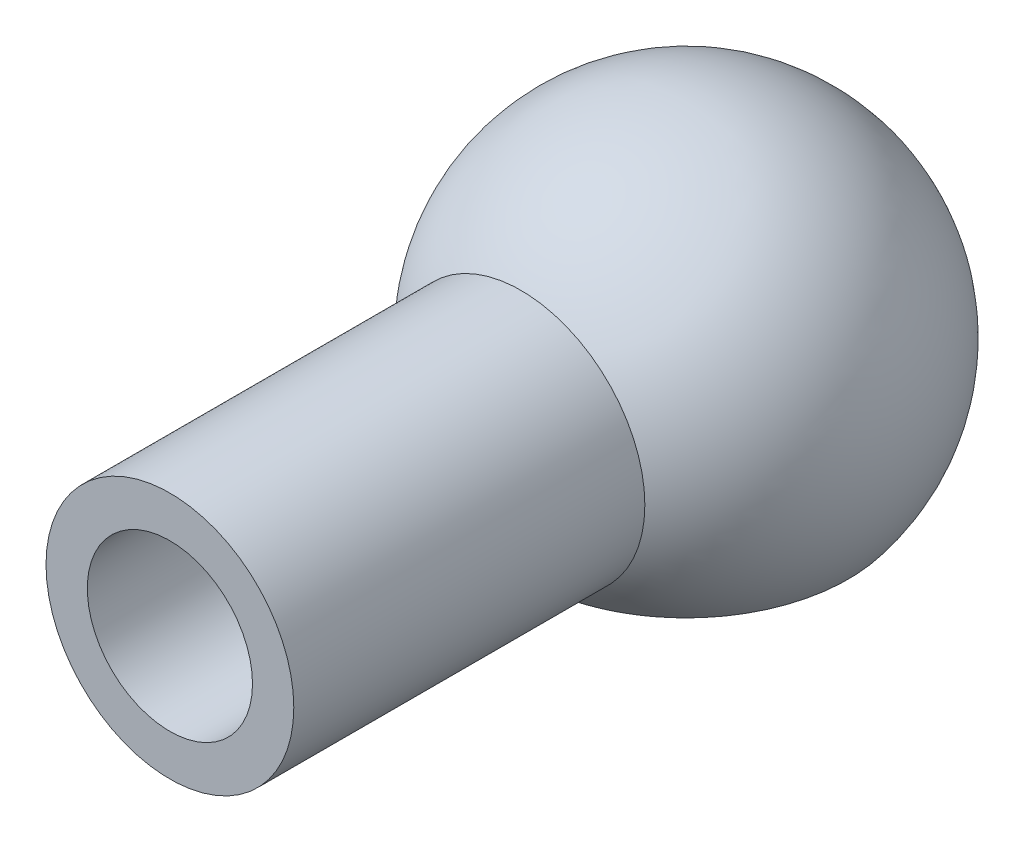
ISO-10303-21;
HEADER;
FILE_DESCRIPTION(('STEP AP214'),'2;1');
FILE_NAME('part.step','',(''),(''),'','','');
FILE_SCHEMA(('AUTOMOTIVE_DESIGN { 1 0 10303 214 1 1 1 1 }'));
ENDSEC;
DATA;
#1=APPLICATION_CONTEXT('core data for automotive mechanical design processes');
#2=APPLICATION_PROTOCOL_DEFINITION('international standard','automotive_design',2000,#1);
#3=PRODUCT_CONTEXT('',#1,'mechanical');
#4=PRODUCT('Part','Part','',(#3));
#5=PRODUCT_RELATED_PRODUCT_CATEGORY('part','',(#4));
#6=PRODUCT_DEFINITION_FORMATION('','',#4);
#7=PRODUCT_DEFINITION_CONTEXT('part definition',#1,'design');
#8=PRODUCT_DEFINITION('design','',#6,#7);
#9=PRODUCT_DEFINITION_SHAPE('','',#8);
#10=(LENGTH_UNIT() NAMED_UNIT(*) SI_UNIT(.MILLI.,.METRE.));
#11=(NAMED_UNIT(*) PLANE_ANGLE_UNIT() SI_UNIT($,.RADIAN.));
#12=(NAMED_UNIT(*) SI_UNIT($,.STERADIAN.) SOLID_ANGLE_UNIT());
#13=UNCERTAINTY_MEASURE_WITH_UNIT(LENGTH_MEASURE(1.E-05),#10,'distance_accuracy_value','');
#14=(GEOMETRIC_REPRESENTATION_CONTEXT(3) GLOBAL_UNCERTAINTY_ASSIGNED_CONTEXT((#13)) GLOBAL_UNIT_ASSIGNED_CONTEXT((#10,
#11,#12)) REPRESENTATION_CONTEXT('',''));
#15=CARTESIAN_POINT('',(0.,0.,0.));
#16=DIRECTION('',(0.,0.,1.));
#17=DIRECTION('',(1.,0.,0.));
#18=AXIS2_PLACEMENT_3D('',#15,#16,#17);
#19=CARTESIAN_POINT('',(0.,0.,0.));
#20=DIRECTION('',(0.,0.,1.));
#21=DIRECTION('',(-1.,0.,0.));
#22=AXIS2_PLACEMENT_3D('',#19,#20,#21);
#23=SPHERICAL_SURFACE('',#22,10.);
#24=CARTESIAN_POINT('',(0.,-6.18589574131742,0.));
#25=DIRECTION('',(0.,-1.,0.));
#26=DIRECTION('',(0.,0.,-1.));
#27=AXIS2_PLACEMENT_3D('',#24,#25,#26);
#28=CIRCLE('',#27,7.85714285714286);
#29=CARTESIAN_POINT('',(0.,-6.18589574131742,-7.85714285714286));
#30=VERTEX_POINT('',#29);
#31=EDGE_CURVE('E57',#30,#30,#28,.T.);
#32=ORIENTED_EDGE('',*,*,#31,.F.);
#33=EDGE_LOOP('',(#32));
#34=FACE_BOUND('',#33,.T.);
#35=CARTESIAN_POINT('',(0.,0.,8.));
#36=DIRECTION('',(0.,0.,-1.));
#37=DIRECTION('',(-1.,0.,0.));
#38=AXIS2_PLACEMENT_3D('',#35,#36,#37);
#39=CIRCLE('',#38,6.);
#40=CARTESIAN_POINT('',(-6.,0.,8.));
#41=VERTEX_POINT('',#40);
#42=EDGE_CURVE('E10',#41,#41,#39,.T.);
#43=ORIENTED_EDGE('',*,*,#42,.T.);
#44=EDGE_LOOP('',(#43));
#45=FACE_BOUND('',#44,.T.);
#46=ADVANCED_FACE('F33',(#34,#45),#23,.T.);
#47=CARTESIAN_POINT('',(0.,0.,25.));
#48=DIRECTION('',(0.,0.,-1.));
#49=DIRECTION('',(-1.,0.,0.));
#50=AXIS2_PLACEMENT_3D('',#47,#48,#49);
#51=CYLINDRICAL_SURFACE('',#50,6.);
#52=CARTESIAN_POINT('',(0.,0.,25.));
#53=DIRECTION('',(0.,0.,1.));
#54=DIRECTION('',(1.,0.,0.));
#55=AXIS2_PLACEMENT_3D('',#52,#53,#54);
#56=CIRCLE('',#55,6.);
#57=CARTESIAN_POINT('',(6.,0.,25.));
#58=VERTEX_POINT('',#57);
#59=EDGE_CURVE('E37',#58,#58,#56,.T.);
#60=ORIENTED_EDGE('',*,*,#59,.F.);
#61=EDGE_LOOP('',(#60));
#62=FACE_BOUND('',#61,.T.);
#63=ORIENTED_EDGE('',*,*,#42,.F.);
#64=EDGE_LOOP('',(#63));
#65=FACE_BOUND('',#64,.T.);
#66=ADVANCED_FACE('F35',(#62,#65),#51,.T.);
#67=CARTESIAN_POINT('',(0.,0.,25.));
#68=DIRECTION('',(0.,0.,-1.));
#69=DIRECTION('',(-1.,0.,0.));
#70=AXIS2_PLACEMENT_3D('',#67,#68,#69);
#71=CYLINDRICAL_SURFACE('',#70,4.);
#72=CARTESIAN_POINT('',(0.,0.,25.));
#73=DIRECTION('',(0.,0.,1.));
#74=DIRECTION('',(1.,0.,0.));
#75=AXIS2_PLACEMENT_3D('',#72,#73,#74);
#76=CIRCLE('',#75,4.);
#77=CARTESIAN_POINT('',(4.,0.,25.));
#78=VERTEX_POINT('',#77);
#79=EDGE_CURVE('E45',#78,#78,#76,.T.);
#80=ORIENTED_EDGE('',*,*,#79,.T.);
#81=EDGE_LOOP('',(#80));
#82=FACE_BOUND('',#81,.T.);
#83=CARTESIAN_POINT('',(0.,0.,8.));
#84=DIRECTION('',(0.,0.,1.));
#85=DIRECTION('',(1.,0.,0.));
#86=AXIS2_PLACEMENT_3D('',#83,#84,#85);
#87=CIRCLE('',#86,4.);
#88=CARTESIAN_POINT('',(4.,0.,8.));
#89=VERTEX_POINT('',#88);
#90=EDGE_CURVE('E47',#89,#89,#87,.T.);
#91=ORIENTED_EDGE('',*,*,#90,.F.);
#92=EDGE_LOOP('',(#91));
#93=FACE_BOUND('',#92,.T.);
#94=ADVANCED_FACE('F71',(#82,#93),#71,.F.);
#95=CARTESIAN_POINT('',(0.,0.,25.));
#96=DIRECTION('',(0.,0.,1.));
#97=DIRECTION('',(1.,0.,0.));
#98=AXIS2_PLACEMENT_3D('',#95,#96,#97);
#99=PLANE('',#98);
#100=ORIENTED_EDGE('',*,*,#59,.T.);
#101=EDGE_LOOP('',(#100));
#102=FACE_BOUND('',#101,.T.);
#103=ORIENTED_EDGE('',*,*,#79,.F.);
#104=EDGE_LOOP('',(#103));
#105=FACE_BOUND('',#104,.T.);
#106=ADVANCED_FACE('F78',(#102,#105),#99,.T.);
#107=CARTESIAN_POINT('',(0.,0.,8.));
#108=DIRECTION('',(0.,0.,1.));
#109=DIRECTION('',(1.,0.,0.));
#110=AXIS2_PLACEMENT_3D('',#107,#108,#109);
#111=PLANE('',#110);
#112=ORIENTED_EDGE('',*,*,#90,.T.);
#113=EDGE_LOOP('',(#112));
#114=FACE_BOUND('',#113,.T.);
#115=ADVANCED_FACE('F75',(#114),#111,.T.);
#116=CARTESIAN_POINT('',(0.,0.,0.));
#117=DIRECTION('',(0.,-1.,0.));
#118=DIRECTION('',(0.,0.,-1.));
#119=AXIS2_PLACEMENT_3D('',#116,#117,#118);
#120=SPHERICAL_SURFACE('',#119,7.);
#121=CARTESIAN_POINT('',(0.,-4.33012701892219,0.));
#122=DIRECTION('',(0.,-1.,0.));
#123=DIRECTION('',(0.,0.,-1.));
#124=AXIS2_PLACEMENT_3D('',#121,#122,#123);
#125=CIRCLE('',#124,5.5);
#126=CARTESIAN_POINT('',(0.,-4.33012701892219,-5.5));
#127=VERTEX_POINT('',#126);
#128=EDGE_CURVE('E53',#127,#127,#125,.T.);
#129=ORIENTED_EDGE('',*,*,#128,.T.);
#130=EDGE_LOOP('',(#129));
#131=FACE_BOUND('',#130,.T.);
#132=ADVANCED_FACE('F84',(#131),#120,.F.);
#133=CARTESIAN_POINT('',(0.,-6.18589574131742,0.));
#134=DIRECTION('',(0.,-1.,0.));
#135=DIRECTION('',(0.,0.,-1.));
#136=AXIS2_PLACEMENT_3D('',#133,#134,#135);
#137=CONICAL_SURFACE('',#136,7.85714285714286,0.903849982291233);
#138=ORIENTED_EDGE('',*,*,#128,.F.);
#139=EDGE_LOOP('',(#138));
#140=FACE_BOUND('',#139,.T.);
#141=ORIENTED_EDGE('',*,*,#31,.T.);
#142=EDGE_LOOP('',(#141));
#143=FACE_BOUND('',#142,.T.);
#144=ADVANCED_FACE('F64',(#140,#143),#137,.F.);
#145=CLOSED_SHELL('',(#46,#66,#94,#106,#115,#132,#144));
#146=MANIFOLD_SOLID_BREP('B2',#145);
#147=ADVANCED_BREP_SHAPE_REPRESENTATION('',(#18,#146),#14);
#148=SHAPE_DEFINITION_REPRESENTATION(#9,#147);
ENDSEC;
END-ISO-10303-21;
